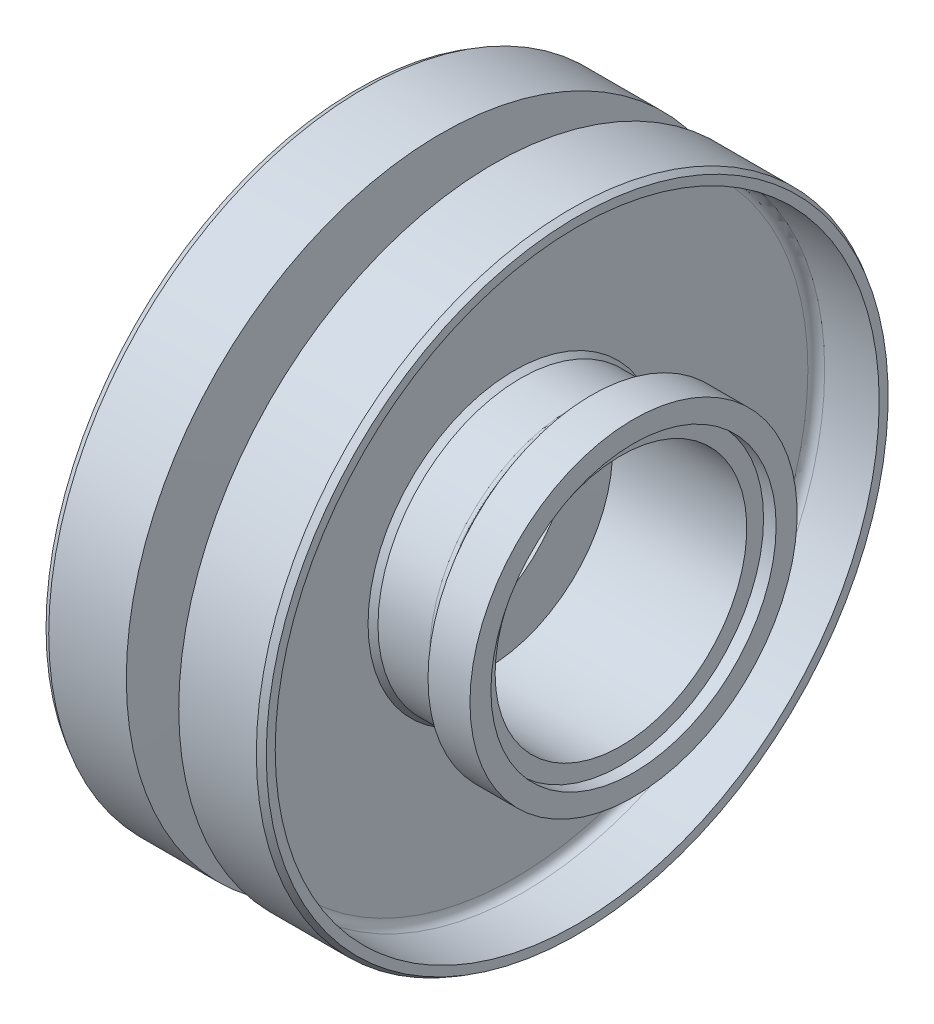
ISO-10303-21;
HEADER;
FILE_DESCRIPTION(('STEP AP214'),'2;1');
FILE_NAME('part.step','',(''),(''),'','','');
FILE_SCHEMA(('AUTOMOTIVE_DESIGN { 1 0 10303 214 1 1 1 1 }'));
ENDSEC;
DATA;
#1=APPLICATION_CONTEXT('core data for automotive mechanical design processes');
#2=APPLICATION_PROTOCOL_DEFINITION('international standard','automotive_design',2000,#1);
#3=PRODUCT_CONTEXT('',#1,'mechanical');
#4=PRODUCT('Part','Part','',(#3));
#5=PRODUCT_RELATED_PRODUCT_CATEGORY('part','',(#4));
#6=PRODUCT_DEFINITION_FORMATION('','',#4);
#7=PRODUCT_DEFINITION_CONTEXT('part definition',#1,'design');
#8=PRODUCT_DEFINITION('design','',#6,#7);
#9=PRODUCT_DEFINITION_SHAPE('','',#8);
#10=(LENGTH_UNIT() NAMED_UNIT(*) SI_UNIT(.MILLI.,.METRE.));
#11=(NAMED_UNIT(*) PLANE_ANGLE_UNIT() SI_UNIT($,.RADIAN.));
#12=(NAMED_UNIT(*) SI_UNIT($,.STERADIAN.) SOLID_ANGLE_UNIT());
#13=UNCERTAINTY_MEASURE_WITH_UNIT(LENGTH_MEASURE(1.E-05),#10,'distance_accuracy_value','');
#14=(GEOMETRIC_REPRESENTATION_CONTEXT(3) GLOBAL_UNCERTAINTY_ASSIGNED_CONTEXT((#13)) GLOBAL_UNIT_ASSIGNED_CONTEXT((#10,
#11,#12)) REPRESENTATION_CONTEXT('',''));
#15=CARTESIAN_POINT('',(0.,0.,0.));
#16=DIRECTION('',(0.,0.,1.));
#17=DIRECTION('',(1.,0.,0.));
#18=AXIS2_PLACEMENT_3D('',#15,#16,#17);
#19=CARTESIAN_POINT('',(-25.0552786765821,0.,0.));
#20=DIRECTION('',(-1.,0.,0.));
#21=DIRECTION('',(0.,0.,1.));
#22=AXIS2_PLACEMENT_3D('',#19,#20,#21);
#23=TOROIDAL_SURFACE('',#22,36.,2.);
#24=CARTESIAN_POINT('',(-26.6785653728717,0.,0.));
#25=DIRECTION('',(-1.,0.,0.));
#26=DIRECTION('',(0.,0.,1.));
#27=AXIS2_PLACEMENT_3D('',#24,#25,#26);
#28=CIRCLE('',#27,34.8316934042602);
#29=CARTESIAN_POINT('',(-26.6785653728717,0.,34.8316934042602));
#30=VERTEX_POINT('',#29);
#31=EDGE_CURVE('E97',#30,#30,#28,.T.);
#32=ORIENTED_EDGE('',*,*,#31,.F.);
#33=EDGE_LOOP('',(#32));
#34=FACE_BOUND('',#33,.T.);
#35=CARTESIAN_POINT('',(-25.0552786765821,0.,0.));
#36=DIRECTION('',(-1.,0.,0.));
#37=DIRECTION('',(0.,0.,1.));
#38=AXIS2_PLACEMENT_3D('',#35,#36,#37);
#39=CIRCLE('',#38,34.);
#40=CARTESIAN_POINT('',(-25.0552786765821,0.,34.));
#41=VERTEX_POINT('',#40);
#42=EDGE_CURVE('E11',#41,#41,#39,.T.);
#43=ORIENTED_EDGE('',*,*,#42,.T.);
#44=EDGE_LOOP('',(#43));
#45=FACE_BOUND('',#44,.T.);
#46=ADVANCED_FACE('F45',(#34,#45),#23,.F.);
#47=CARTESIAN_POINT('',(0.,0.,0.));
#48=DIRECTION('',(-1.,0.,0.));
#49=DIRECTION('',(0.,0.,1.));
#50=AXIS2_PLACEMENT_3D('',#47,#48,#49);
#51=CYLINDRICAL_SURFACE('',#50,34.);
#52=ORIENTED_EDGE('',*,*,#42,.F.);
#53=EDGE_LOOP('',(#52));
#54=FACE_BOUND('',#53,.T.);
#55=CARTESIAN_POINT('',(-12.75,0.,0.));
#56=DIRECTION('',(-1.,0.,0.));
#57=DIRECTION('',(0.,0.,1.));
#58=AXIS2_PLACEMENT_3D('',#55,#56,#57);
#59=CIRCLE('',#58,34.);
#60=CARTESIAN_POINT('',(-12.75,0.,34.));
#61=VERTEX_POINT('',#60);
#62=EDGE_CURVE('E51',#61,#61,#59,.T.);
#63=ORIENTED_EDGE('',*,*,#62,.T.);
#64=EDGE_LOOP('',(#63));
#65=FACE_BOUND('',#64,.T.);
#66=ADVANCED_FACE('F104',(#54,#65),#51,.T.);
#67=CARTESIAN_POINT('',(-11.25,0.,0.));
#68=DIRECTION('',(1.,0.,0.));
#69=DIRECTION('',(0.,0.,-1.));
#70=AXIS2_PLACEMENT_3D('',#67,#68,#69);
#71=CONICAL_SURFACE('',#70,34.8660254037845,0.523598775598304);
#72=ORIENTED_EDGE('',*,*,#62,.F.);
#73=EDGE_LOOP('',(#72));
#74=FACE_BOUND('',#73,.T.);
#75=CARTESIAN_POINT('',(-11.25,0.,0.));
#76=DIRECTION('',(-1.,0.,0.));
#77=DIRECTION('',(0.,0.,1.));
#78=AXIS2_PLACEMENT_3D('',#75,#76,#77);
#79=CIRCLE('',#78,34.8660254037845);
#80=CARTESIAN_POINT('',(-11.25,0.,34.8660254037845));
#81=VERTEX_POINT('',#80);
#82=EDGE_CURVE('E55',#81,#81,#79,.T.);
#83=ORIENTED_EDGE('',*,*,#82,.T.);
#84=EDGE_LOOP('',(#83));
#85=FACE_BOUND('',#84,.T.);
#86=ADVANCED_FACE('F108',(#74,#85),#71,.T.);
#87=CARTESIAN_POINT('',(-11.25,70.,0.));
#88=DIRECTION('',(1.,0.,0.));
#89=DIRECTION('',(0.,0.,-1.));
#90=AXIS2_PLACEMENT_3D('',#87,#88,#89);
#91=PLANE('',#90);
#92=ORIENTED_EDGE('',*,*,#82,.F.);
#93=EDGE_LOOP('',(#92));
#94=FACE_BOUND('',#93,.T.);
#95=CARTESIAN_POINT('',(-11.25,0.,0.));
#96=DIRECTION('',(-1.,0.,0.));
#97=DIRECTION('',(0.,0.,1.));
#98=AXIS2_PLACEMENT_3D('',#95,#96,#97);
#99=CIRCLE('',#98,70.);
#100=CARTESIAN_POINT('',(-11.25,0.,70.));
#101=VERTEX_POINT('',#100);
#102=EDGE_CURVE('E59',#101,#101,#99,.T.);
#103=ORIENTED_EDGE('',*,*,#102,.T.);
#104=EDGE_LOOP('',(#103));
#105=FACE_BOUND('',#104,.T.);
#106=ADVANCED_FACE('F113',(#94,#105),#91,.F.);
#107=CARTESIAN_POINT('',(-13.25,0.,0.));
#108=DIRECTION('',(-1.,0.,0.));
#109=DIRECTION('',(0.,0.,1.));
#110=AXIS2_PLACEMENT_3D('',#107,#108,#109);
#111=TOROIDAL_SURFACE('',#110,70.,1.99999999999999);
#112=ORIENTED_EDGE('',*,*,#102,.F.);
#113=EDGE_LOOP('',(#112));
#114=FACE_BOUND('',#113,.T.);
#115=CARTESIAN_POINT('',(-13.25,0.,0.));
#116=DIRECTION('',(-1.,0.,0.));
#117=DIRECTION('',(0.,0.,1.));
#118=AXIS2_PLACEMENT_3D('',#115,#116,#117);
#119=CIRCLE('',#118,72.);
#120=CARTESIAN_POINT('',(-13.25,0.,72.));
#121=VERTEX_POINT('',#120);
#122=EDGE_CURVE('E64',#121,#121,#119,.T.);
#123=ORIENTED_EDGE('',*,*,#122,.T.);
#124=EDGE_LOOP('',(#123));
#125=FACE_BOUND('',#124,.T.);
#126=ADVANCED_FACE('F119',(#114,#125),#111,.F.);
#127=CARTESIAN_POINT('',(0.,0.,0.));
#128=DIRECTION('',(-1.,0.,0.));
#129=DIRECTION('',(0.,0.,1.));
#130=AXIS2_PLACEMENT_3D('',#127,#128,#129);
#131=CYLINDRICAL_SURFACE('',#130,72.);
#132=ORIENTED_EDGE('',*,*,#122,.F.);
#133=EDGE_LOOP('',(#132));
#134=FACE_BOUND('',#133,.T.);
#135=CARTESIAN_POINT('',(-26.25,0.,0.));
#136=DIRECTION('',(-1.,0.,0.));
#137=DIRECTION('',(0.,0.,1.));
#138=AXIS2_PLACEMENT_3D('',#135,#136,#137);
#139=CIRCLE('',#138,72.);
#140=CARTESIAN_POINT('',(-26.25,0.,72.));
#141=VERTEX_POINT('',#140);
#142=EDGE_CURVE('E67',#141,#141,#139,.T.);
#143=ORIENTED_EDGE('',*,*,#142,.T.);
#144=EDGE_LOOP('',(#143));
#145=FACE_BOUND('',#144,.T.);
#146=ADVANCED_FACE('F123',(#134,#145),#131,.F.);
#147=CARTESIAN_POINT('',(-26.25,74.1339745962156,0.));
#148=DIRECTION('',(1.,0.,0.));
#149=DIRECTION('',(0.,0.,-1.));
#150=AXIS2_PLACEMENT_3D('',#147,#148,#149);
#151=PLANE('',#150);
#152=ORIENTED_EDGE('',*,*,#142,.F.);
#153=EDGE_LOOP('',(#152));
#154=FACE_BOUND('',#153,.T.);
#155=CARTESIAN_POINT('',(-26.25,0.,0.));
#156=DIRECTION('',(-1.,0.,0.));
#157=DIRECTION('',(0.,0.,1.));
#158=AXIS2_PLACEMENT_3D('',#155,#156,#157);
#159=CIRCLE('',#158,74.1339745962156);
#160=CARTESIAN_POINT('',(-26.25,0.,74.1339745962156));
#161=VERTEX_POINT('',#160);
#162=EDGE_CURVE('E70',#161,#161,#159,.T.);
#163=ORIENTED_EDGE('',*,*,#162,.T.);
#164=EDGE_LOOP('',(#163));
#165=FACE_BOUND('',#164,.T.);
#166=ADVANCED_FACE('F127',(#154,#165),#151,.F.);
#167=CARTESIAN_POINT('',(-24.75,0.,0.));
#168=DIRECTION('',(1.,0.,0.));
#169=DIRECTION('',(0.,0.,-1.));
#170=AXIS2_PLACEMENT_3D('',#167,#168,#169);
#171=CONICAL_SURFACE('',#170,75.,0.523598775598296);
#172=ORIENTED_EDGE('',*,*,#162,.F.);
#173=EDGE_LOOP('',(#172));
#174=FACE_BOUND('',#173,.T.);
#175=CARTESIAN_POINT('',(-24.75,0.,0.));
#176=DIRECTION('',(-1.,0.,0.));
#177=DIRECTION('',(0.,0.,1.));
#178=AXIS2_PLACEMENT_3D('',#175,#176,#177);
#179=CIRCLE('',#178,75.);
#180=CARTESIAN_POINT('',(-24.75,0.,75.));
#181=VERTEX_POINT('',#180);
#182=EDGE_CURVE('E73',#181,#181,#179,.T.);
#183=ORIENTED_EDGE('',*,*,#182,.T.);
#184=EDGE_LOOP('',(#183));
#185=FACE_BOUND('',#184,.T.);
#186=ADVANCED_FACE('F131',(#174,#185),#171,.T.);
#187=CARTESIAN_POINT('',(0.,0.,0.));
#188=DIRECTION('',(-1.,0.,0.));
#189=DIRECTION('',(0.,0.,1.));
#190=AXIS2_PLACEMENT_3D('',#187,#188,#189);
#191=CYLINDRICAL_SURFACE('',#190,75.);
#192=ORIENTED_EDGE('',*,*,#182,.F.);
#193=EDGE_LOOP('',(#192));
#194=FACE_BOUND('',#193,.T.);
#195=CARTESIAN_POINT('',(-6.25,0.,0.));
#196=DIRECTION('',(-1.,0.,0.));
#197=DIRECTION('',(0.,0.,1.));
#198=AXIS2_PLACEMENT_3D('',#195,#196,#197);
#199=CIRCLE('',#198,75.);
#200=CARTESIAN_POINT('',(-6.25,0.,75.));
#201=VERTEX_POINT('',#200);
#202=EDGE_CURVE('E76',#201,#201,#199,.T.);
#203=ORIENTED_EDGE('',*,*,#202,.T.);
#204=EDGE_LOOP('',(#203));
#205=FACE_BOUND('',#204,.T.);
#206=ADVANCED_FACE('F135',(#194,#205),#191,.T.);
#207=CARTESIAN_POINT('',(-4.67856537287168,0.,0.));
#208=DIRECTION('',(-1.,0.,0.));
#209=DIRECTION('',(0.,0.,1.));
#210=AXIS2_PLACEMENT_3D('',#207,#208,#209);
#211=CONICAL_SURFACE('',#210,30.,1.53588974175502);
#212=ORIENTED_EDGE('',*,*,#202,.F.);
#213=EDGE_LOOP('',(#212));
#214=FACE_BOUND('',#213,.T.);
#215=CARTESIAN_POINT('',(-4.67856537287168,0.,0.));
#216=DIRECTION('',(-1.,0.,0.));
#217=DIRECTION('',(0.,0.,1.));
#218=AXIS2_PLACEMENT_3D('',#215,#216,#217);
#219=CIRCLE('',#218,30.);
#220=CARTESIAN_POINT('',(-4.67856537287168,0.,30.));
#221=VERTEX_POINT('',#220);
#222=EDGE_CURVE('E79',#221,#221,#219,.T.);
#223=ORIENTED_EDGE('',*,*,#222,.T.);
#224=EDGE_LOOP('',(#223));
#225=FACE_BOUND('',#224,.T.);
#226=ADVANCED_FACE('F139',(#214,#225),#211,.T.);
#227=CARTESIAN_POINT('',(0.,0.,0.));
#228=DIRECTION('',(-1.,0.,0.));
#229=DIRECTION('',(0.,0.,1.));
#230=AXIS2_PLACEMENT_3D('',#227,#228,#229);
#231=CYLINDRICAL_SURFACE('',#230,30.);
#232=ORIENTED_EDGE('',*,*,#222,.F.);
#233=EDGE_LOOP('',(#232));
#234=FACE_BOUND('',#233,.T.);
#235=CARTESIAN_POINT('',(-36.6785653728717,0.,0.));
#236=DIRECTION('',(-1.,0.,0.));
#237=DIRECTION('',(0.,0.,1.));
#238=AXIS2_PLACEMENT_3D('',#235,#236,#237);
#239=CIRCLE('',#238,30.);
#240=CARTESIAN_POINT('',(-36.6785653728717,0.,30.));
#241=VERTEX_POINT('',#240);
#242=EDGE_CURVE('E82',#241,#241,#239,.T.);
#243=ORIENTED_EDGE('',*,*,#242,.T.);
#244=EDGE_LOOP('',(#243));
#245=FACE_BOUND('',#244,.T.);
#246=ADVANCED_FACE('F143',(#234,#245),#231,.F.);
#247=CARTESIAN_POINT('',(-36.6785653728717,34.,0.));
#248=DIRECTION('',(1.,0.,0.));
#249=DIRECTION('',(0.,0.,-1.));
#250=AXIS2_PLACEMENT_3D('',#247,#248,#249);
#251=PLANE('',#250);
#252=ORIENTED_EDGE('',*,*,#242,.F.);
#253=EDGE_LOOP('',(#252));
#254=FACE_BOUND('',#253,.T.);
#255=CARTESIAN_POINT('',(-36.6785653728717,0.,0.));
#256=DIRECTION('',(-1.,0.,0.));
#257=DIRECTION('',(0.,0.,1.));
#258=AXIS2_PLACEMENT_3D('',#255,#256,#257);
#259=CIRCLE('',#258,34.);
#260=CARTESIAN_POINT('',(-36.6785653728717,0.,34.));
#261=VERTEX_POINT('',#260);
#262=EDGE_CURVE('E85',#261,#261,#259,.T.);
#263=ORIENTED_EDGE('',*,*,#262,.T.);
#264=EDGE_LOOP('',(#263));
#265=FACE_BOUND('',#264,.T.);
#266=ADVANCED_FACE('F147',(#254,#265),#251,.F.);
#267=CARTESIAN_POINT('',(0.,0.,0.));
#268=DIRECTION('',(-1.,0.,0.));
#269=DIRECTION('',(0.,0.,1.));
#270=AXIS2_PLACEMENT_3D('',#267,#268,#269);
#271=CYLINDRICAL_SURFACE('',#270,34.);
#272=ORIENTED_EDGE('',*,*,#262,.F.);
#273=EDGE_LOOP('',(#272));
#274=FACE_BOUND('',#273,.T.);
#275=CARTESIAN_POINT('',(-39.6785653728717,0.,0.));
#276=DIRECTION('',(-1.,0.,0.));
#277=DIRECTION('',(0.,0.,1.));
#278=AXIS2_PLACEMENT_3D('',#275,#276,#277);
#279=CIRCLE('',#278,34.);
#280=CARTESIAN_POINT('',(-39.6785653728717,0.,34.));
#281=VERTEX_POINT('',#280);
#282=EDGE_CURVE('E88',#281,#281,#279,.T.);
#283=ORIENTED_EDGE('',*,*,#282,.T.);
#284=EDGE_LOOP('',(#283));
#285=FACE_BOUND('',#284,.T.);
#286=ADVANCED_FACE('F151',(#274,#285),#271,.F.);
#287=CARTESIAN_POINT('',(-39.6785653728717,39.,0.));
#288=DIRECTION('',(1.,0.,0.));
#289=DIRECTION('',(0.,0.,-1.));
#290=AXIS2_PLACEMENT_3D('',#287,#288,#289);
#291=PLANE('',#290);
#292=ORIENTED_EDGE('',*,*,#282,.F.);
#293=EDGE_LOOP('',(#292));
#294=FACE_BOUND('',#293,.T.);
#295=CARTESIAN_POINT('',(-39.6785653728717,0.,0.));
#296=DIRECTION('',(-1.,0.,0.));
#297=DIRECTION('',(0.,0.,1.));
#298=AXIS2_PLACEMENT_3D('',#295,#296,#297);
#299=CIRCLE('',#298,39.);
#300=CARTESIAN_POINT('',(-39.6785653728717,0.,39.));
#301=VERTEX_POINT('',#300);
#302=EDGE_CURVE('E91',#301,#301,#299,.T.);
#303=ORIENTED_EDGE('',*,*,#302,.T.);
#304=EDGE_LOOP('',(#303));
#305=FACE_BOUND('',#304,.T.);
#306=ADVANCED_FACE('F155',(#294,#305),#291,.F.);
#307=CARTESIAN_POINT('',(0.,0.,0.));
#308=DIRECTION('',(-1.,0.,0.));
#309=DIRECTION('',(0.,0.,1.));
#310=AXIS2_PLACEMENT_3D('',#307,#308,#309);
#311=CYLINDRICAL_SURFACE('',#310,39.);
#312=ORIENTED_EDGE('',*,*,#302,.F.);
#313=EDGE_LOOP('',(#312));
#314=FACE_BOUND('',#313,.T.);
#315=CARTESIAN_POINT('',(-29.6785653728717,0.,0.));
#316=DIRECTION('',(-1.,0.,0.));
#317=DIRECTION('',(0.,0.,1.));
#318=AXIS2_PLACEMENT_3D('',#315,#316,#317);
#319=CIRCLE('',#318,39.);
#320=CARTESIAN_POINT('',(-29.6785653728717,0.,39.));
#321=VERTEX_POINT('',#320);
#322=EDGE_CURVE('E94',#321,#321,#319,.T.);
#323=ORIENTED_EDGE('',*,*,#322,.T.);
#324=EDGE_LOOP('',(#323));
#325=FACE_BOUND('',#324,.T.);
#326=ADVANCED_FACE('F159',(#314,#325),#311,.T.);
#327=CARTESIAN_POINT('',(-26.6785653728717,0.,0.));
#328=DIRECTION('',(-1.,0.,0.));
#329=DIRECTION('',(0.,0.,1.));
#330=AXIS2_PLACEMENT_3D('',#327,#328,#329);
#331=CONICAL_SURFACE('',#330,34.8316934042602,0.946959855947359);
#332=ORIENTED_EDGE('',*,*,#322,.F.);
#333=EDGE_LOOP('',(#332));
#334=FACE_BOUND('',#333,.T.);
#335=ORIENTED_EDGE('',*,*,#31,.T.);
#336=EDGE_LOOP('',(#335));
#337=FACE_BOUND('',#336,.T.);
#338=ADVANCED_FACE('F101',(#334,#337),#331,.T.);
#339=CLOSED_SHELL('',(#46,#66,#86,#106,#126,#146,#166,#186,#206,#226,#246,#266,#286,#306,#326,#338));
#340=MANIFOLD_SOLID_BREP('B2',#339);
#341=CARTESIAN_POINT('',(6.25,0.,0.));
#342=DIRECTION('',(1.,0.,0.));
#343=DIRECTION('',(0.,0.,-1.));
#344=AXIS2_PLACEMENT_3D('',#341,#342,#343);
#345=CONICAL_SURFACE('',#344,75.,1.53588974175502);
#346=CARTESIAN_POINT('',(4.67856537287168,0.,0.));
#347=DIRECTION('',(-1.,0.,0.));
#348=DIRECTION('',(0.,0.,1.));
#349=AXIS2_PLACEMENT_3D('',#346,#347,#348);
#350=CIRCLE('',#349,30.);
#351=CARTESIAN_POINT('',(4.67856537287168,0.,30.));
#352=VERTEX_POINT('',#351);
#353=EDGE_CURVE('E44',#352,#352,#350,.T.);
#354=ORIENTED_EDGE('',*,*,#353,.F.);
#355=EDGE_LOOP('',(#354));
#356=FACE_BOUND('',#355,.T.);
#357=CARTESIAN_POINT('',(6.25,0.,0.));
#358=DIRECTION('',(-1.,0.,0.));
#359=DIRECTION('',(0.,0.,1.));
#360=AXIS2_PLACEMENT_3D('',#357,#358,#359);
#361=CIRCLE('',#360,75.);
#362=CARTESIAN_POINT('',(6.25,0.,75.));
#363=VERTEX_POINT('',#362);
#364=EDGE_CURVE('E371',#363,#363,#361,.T.);
#365=ORIENTED_EDGE('',*,*,#364,.T.);
#366=EDGE_LOOP('',(#365));
#367=FACE_BOUND('',#366,.T.);
#368=ADVANCED_FACE('F319',(#356,#367),#345,.T.);
#369=CARTESIAN_POINT('',(0.,0.,0.));
#370=DIRECTION('',(-1.,0.,0.));
#371=DIRECTION('',(0.,0.,1.));
#372=AXIS2_PLACEMENT_3D('',#369,#370,#371);
#373=CYLINDRICAL_SURFACE('',#372,30.);
#374=CARTESIAN_POINT('',(36.6785653728717,0.,0.));
#375=DIRECTION('',(-1.,0.,0.));
#376=DIRECTION('',(0.,0.,1.));
#377=AXIS2_PLACEMENT_3D('',#374,#375,#376);
#378=CIRCLE('',#377,30.);
#379=CARTESIAN_POINT('',(36.6785653728717,0.,30.));
#380=VERTEX_POINT('',#379);
#381=EDGE_CURVE('E325',#380,#380,#378,.T.);
#382=ORIENTED_EDGE('',*,*,#381,.F.);
#383=EDGE_LOOP('',(#382));
#384=FACE_BOUND('',#383,.T.);
#385=ORIENTED_EDGE('',*,*,#353,.T.);
#386=EDGE_LOOP('',(#385));
#387=FACE_BOUND('',#386,.T.);
#388=ADVANCED_FACE('F456',(#384,#387),#373,.F.);
#389=CARTESIAN_POINT('',(36.6785653728717,34.,0.));
#390=DIRECTION('',(-1.,0.,0.));
#391=DIRECTION('',(0.,0.,1.));
#392=AXIS2_PLACEMENT_3D('',#389,#390,#391);
#393=PLANE('',#392);
#394=CARTESIAN_POINT('',(36.6785653728717,0.,0.));
#395=DIRECTION('',(-1.,0.,0.));
#396=DIRECTION('',(0.,0.,1.));
#397=AXIS2_PLACEMENT_3D('',#394,#395,#396);
#398=CIRCLE('',#397,34.);
#399=CARTESIAN_POINT('',(36.6785653728717,0.,34.));
#400=VERTEX_POINT('',#399);
#401=EDGE_CURVE('E329',#400,#400,#398,.T.);
#402=ORIENTED_EDGE('',*,*,#401,.F.);
#403=EDGE_LOOP('',(#402));
#404=FACE_BOUND('',#403,.T.);
#405=ORIENTED_EDGE('',*,*,#381,.T.);
#406=EDGE_LOOP('',(#405));
#407=FACE_BOUND('',#406,.T.);
#408=ADVANCED_FACE('F451',(#404,#407),#393,.F.);
#409=CARTESIAN_POINT('',(0.,0.,0.));
#410=DIRECTION('',(-1.,0.,0.));
#411=DIRECTION('',(0.,0.,1.));
#412=AXIS2_PLACEMENT_3D('',#409,#410,#411);
#413=CYLINDRICAL_SURFACE('',#412,34.);
#414=CARTESIAN_POINT('',(39.6785653728717,0.,0.));
#415=DIRECTION('',(-1.,0.,0.));
#416=DIRECTION('',(0.,0.,1.));
#417=AXIS2_PLACEMENT_3D('',#414,#415,#416);
#418=CIRCLE('',#417,34.);
#419=CARTESIAN_POINT('',(39.6785653728717,0.,34.));
#420=VERTEX_POINT('',#419);
#421=EDGE_CURVE('E333',#420,#420,#418,.T.);
#422=ORIENTED_EDGE('',*,*,#421,.F.);
#423=EDGE_LOOP('',(#422));
#424=FACE_BOUND('',#423,.T.);
#425=ORIENTED_EDGE('',*,*,#401,.T.);
#426=EDGE_LOOP('',(#425));
#427=FACE_BOUND('',#426,.T.);
#428=ADVANCED_FACE('F445',(#424,#427),#413,.F.);
#429=CARTESIAN_POINT('',(39.6785653728717,39.,0.));
#430=DIRECTION('',(-1.,0.,0.));
#431=DIRECTION('',(0.,0.,1.));
#432=AXIS2_PLACEMENT_3D('',#429,#430,#431);
#433=PLANE('',#432);
#434=CARTESIAN_POINT('',(39.6785653728717,0.,0.));
#435=DIRECTION('',(-1.,0.,0.));
#436=DIRECTION('',(0.,0.,1.));
#437=AXIS2_PLACEMENT_3D('',#434,#435,#436);
#438=CIRCLE('',#437,39.);
#439=CARTESIAN_POINT('',(39.6785653728717,0.,39.));
#440=VERTEX_POINT('',#439);
#441=EDGE_CURVE('E338',#440,#440,#438,.T.);
#442=ORIENTED_EDGE('',*,*,#441,.F.);
#443=EDGE_LOOP('',(#442));
#444=FACE_BOUND('',#443,.T.);
#445=ORIENTED_EDGE('',*,*,#421,.T.);
#446=EDGE_LOOP('',(#445));
#447=FACE_BOUND('',#446,.T.);
#448=ADVANCED_FACE('F439',(#444,#447),#433,.F.);
#449=CARTESIAN_POINT('',(0.,0.,0.));
#450=DIRECTION('',(-1.,0.,0.));
#451=DIRECTION('',(0.,0.,1.));
#452=AXIS2_PLACEMENT_3D('',#449,#450,#451);
#453=CYLINDRICAL_SURFACE('',#452,39.);
#454=CARTESIAN_POINT('',(29.6785653728717,0.,0.));
#455=DIRECTION('',(-1.,0.,0.));
#456=DIRECTION('',(0.,0.,1.));
#457=AXIS2_PLACEMENT_3D('',#454,#455,#456);
#458=CIRCLE('',#457,39.);
#459=CARTESIAN_POINT('',(29.6785653728717,0.,39.));
#460=VERTEX_POINT('',#459);
#461=EDGE_CURVE('E341',#460,#460,#458,.T.);
#462=ORIENTED_EDGE('',*,*,#461,.F.);
#463=EDGE_LOOP('',(#462));
#464=FACE_BOUND('',#463,.T.);
#465=ORIENTED_EDGE('',*,*,#441,.T.);
#466=EDGE_LOOP('',(#465));
#467=FACE_BOUND('',#466,.T.);
#468=ADVANCED_FACE('F433',(#464,#467),#453,.T.);
#469=CARTESIAN_POINT('',(29.6785653728717,0.,0.));
#470=DIRECTION('',(1.,0.,0.));
#471=DIRECTION('',(0.,0.,-1.));
#472=AXIS2_PLACEMENT_3D('',#469,#470,#471);
#473=CONICAL_SURFACE('',#472,39.,0.946959855947359);
#474=CARTESIAN_POINT('',(26.6785653728717,0.,0.));
#475=DIRECTION('',(-1.,0.,0.));
#476=DIRECTION('',(0.,0.,1.));
#477=AXIS2_PLACEMENT_3D('',#474,#475,#476);
#478=CIRCLE('',#477,34.8316934042602);
#479=CARTESIAN_POINT('',(26.6785653728717,0.,34.8316934042602));
#480=VERTEX_POINT('',#479);
#481=EDGE_CURVE('E344',#480,#480,#478,.T.);
#482=ORIENTED_EDGE('',*,*,#481,.F.);
#483=EDGE_LOOP('',(#482));
#484=FACE_BOUND('',#483,.T.);
#485=ORIENTED_EDGE('',*,*,#461,.T.);
#486=EDGE_LOOP('',(#485));
#487=FACE_BOUND('',#486,.T.);
#488=ADVANCED_FACE('F427',(#484,#487),#473,.T.);
#489=CARTESIAN_POINT('',(25.0552786765821,0.,0.));
#490=DIRECTION('',(-1.,0.,0.));
#491=DIRECTION('',(0.,0.,1.));
#492=AXIS2_PLACEMENT_3D('',#489,#490,#491);
#493=TOROIDAL_SURFACE('',#492,36.,2.);
#494=CARTESIAN_POINT('',(25.0552786765821,0.,0.));
#495=DIRECTION('',(-1.,0.,0.));
#496=DIRECTION('',(0.,0.,1.));
#497=AXIS2_PLACEMENT_3D('',#494,#495,#496);
#498=CIRCLE('',#497,34.);
#499=CARTESIAN_POINT('',(25.0552786765821,0.,34.));
#500=VERTEX_POINT('',#499);
#501=EDGE_CURVE('E347',#500,#500,#498,.T.);
#502=ORIENTED_EDGE('',*,*,#501,.F.);
#503=EDGE_LOOP('',(#502));
#504=FACE_BOUND('',#503,.T.);
#505=ORIENTED_EDGE('',*,*,#481,.T.);
#506=EDGE_LOOP('',(#505));
#507=FACE_BOUND('',#506,.T.);
#508=ADVANCED_FACE('F421',(#504,#507),#493,.F.);
#509=CARTESIAN_POINT('',(0.,0.,0.));
#510=DIRECTION('',(-1.,0.,0.));
#511=DIRECTION('',(0.,0.,1.));
#512=AXIS2_PLACEMENT_3D('',#509,#510,#511);
#513=CYLINDRICAL_SURFACE('',#512,34.);
#514=CARTESIAN_POINT('',(12.75,0.,0.));
#515=DIRECTION('',(-1.,0.,0.));
#516=DIRECTION('',(0.,0.,1.));
#517=AXIS2_PLACEMENT_3D('',#514,#515,#516);
#518=CIRCLE('',#517,34.);
#519=CARTESIAN_POINT('',(12.75,0.,34.));
#520=VERTEX_POINT('',#519);
#521=EDGE_CURVE('E350',#520,#520,#518,.T.);
#522=ORIENTED_EDGE('',*,*,#521,.F.);
#523=EDGE_LOOP('',(#522));
#524=FACE_BOUND('',#523,.T.);
#525=ORIENTED_EDGE('',*,*,#501,.T.);
#526=EDGE_LOOP('',(#525));
#527=FACE_BOUND('',#526,.T.);
#528=ADVANCED_FACE('F415',(#524,#527),#513,.T.);
#529=CARTESIAN_POINT('',(12.75,0.,0.));
#530=DIRECTION('',(-1.,0.,0.));
#531=DIRECTION('',(0.,0.,1.));
#532=AXIS2_PLACEMENT_3D('',#529,#530,#531);
#533=CONICAL_SURFACE('',#532,34.,0.523598775598304);
#534=CARTESIAN_POINT('',(11.25,0.,0.));
#535=DIRECTION('',(-1.,0.,0.));
#536=DIRECTION('',(0.,0.,1.));
#537=AXIS2_PLACEMENT_3D('',#534,#535,#536);
#538=CIRCLE('',#537,34.8660254037845);
#539=CARTESIAN_POINT('',(11.25,0.,34.8660254037845));
#540=VERTEX_POINT('',#539);
#541=EDGE_CURVE('E353',#540,#540,#538,.T.);
#542=ORIENTED_EDGE('',*,*,#541,.F.);
#543=EDGE_LOOP('',(#542));
#544=FACE_BOUND('',#543,.T.);
#545=ORIENTED_EDGE('',*,*,#521,.T.);
#546=EDGE_LOOP('',(#545));
#547=FACE_BOUND('',#546,.T.);
#548=ADVANCED_FACE('F409',(#544,#547),#533,.T.);
#549=CARTESIAN_POINT('',(11.25,70.,0.));
#550=DIRECTION('',(-1.,0.,0.));
#551=DIRECTION('',(0.,0.,1.));
#552=AXIS2_PLACEMENT_3D('',#549,#550,#551);
#553=PLANE('',#552);
#554=CARTESIAN_POINT('',(11.25,0.,0.));
#555=DIRECTION('',(-1.,0.,0.));
#556=DIRECTION('',(0.,0.,1.));
#557=AXIS2_PLACEMENT_3D('',#554,#555,#556);
#558=CIRCLE('',#557,70.);
#559=CARTESIAN_POINT('',(11.25,0.,70.));
#560=VERTEX_POINT('',#559);
#561=EDGE_CURVE('E356',#560,#560,#558,.T.);
#562=ORIENTED_EDGE('',*,*,#561,.F.);
#563=EDGE_LOOP('',(#562));
#564=FACE_BOUND('',#563,.T.);
#565=ORIENTED_EDGE('',*,*,#541,.T.);
#566=EDGE_LOOP('',(#565));
#567=FACE_BOUND('',#566,.T.);
#568=ADVANCED_FACE('F403',(#564,#567),#553,.F.);
#569=CARTESIAN_POINT('',(13.25,0.,0.));
#570=DIRECTION('',(-1.,0.,0.));
#571=DIRECTION('',(0.,0.,1.));
#572=AXIS2_PLACEMENT_3D('',#569,#570,#571);
#573=TOROIDAL_SURFACE('',#572,70.,1.99999999999999);
#574=CARTESIAN_POINT('',(13.25,0.,0.));
#575=DIRECTION('',(-1.,0.,0.));
#576=DIRECTION('',(0.,0.,1.));
#577=AXIS2_PLACEMENT_3D('',#574,#575,#576);
#578=CIRCLE('',#577,72.);
#579=CARTESIAN_POINT('',(13.25,0.,72.));
#580=VERTEX_POINT('',#579);
#581=EDGE_CURVE('E359',#580,#580,#578,.T.);
#582=ORIENTED_EDGE('',*,*,#581,.F.);
#583=EDGE_LOOP('',(#582));
#584=FACE_BOUND('',#583,.T.);
#585=ORIENTED_EDGE('',*,*,#561,.T.);
#586=EDGE_LOOP('',(#585));
#587=FACE_BOUND('',#586,.T.);
#588=ADVANCED_FACE('F397',(#584,#587),#573,.F.);
#589=CARTESIAN_POINT('',(0.,0.,0.));
#590=DIRECTION('',(-1.,0.,0.));
#591=DIRECTION('',(0.,0.,1.));
#592=AXIS2_PLACEMENT_3D('',#589,#590,#591);
#593=CYLINDRICAL_SURFACE('',#592,72.);
#594=CARTESIAN_POINT('',(26.25,0.,0.));
#595=DIRECTION('',(-1.,0.,0.));
#596=DIRECTION('',(0.,0.,1.));
#597=AXIS2_PLACEMENT_3D('',#594,#595,#596);
#598=CIRCLE('',#597,72.);
#599=CARTESIAN_POINT('',(26.25,0.,72.));
#600=VERTEX_POINT('',#599);
#601=EDGE_CURVE('E362',#600,#600,#598,.T.);
#602=ORIENTED_EDGE('',*,*,#601,.F.);
#603=EDGE_LOOP('',(#602));
#604=FACE_BOUND('',#603,.T.);
#605=ORIENTED_EDGE('',*,*,#581,.T.);
#606=EDGE_LOOP('',(#605));
#607=FACE_BOUND('',#606,.T.);
#608=ADVANCED_FACE('F391',(#604,#607),#593,.F.);
#609=CARTESIAN_POINT('',(26.25,74.1339745962156,0.));
#610=DIRECTION('',(-1.,0.,0.));
#611=DIRECTION('',(0.,0.,1.));
#612=AXIS2_PLACEMENT_3D('',#609,#610,#611);
#613=PLANE('',#612);
#614=CARTESIAN_POINT('',(26.25,0.,0.));
#615=DIRECTION('',(-1.,0.,0.));
#616=DIRECTION('',(0.,0.,1.));
#617=AXIS2_PLACEMENT_3D('',#614,#615,#616);
#618=CIRCLE('',#617,74.1339745962156);
#619=CARTESIAN_POINT('',(26.25,0.,74.1339745962156));
#620=VERTEX_POINT('',#619);
#621=EDGE_CURVE('E365',#620,#620,#618,.T.);
#622=ORIENTED_EDGE('',*,*,#621,.F.);
#623=EDGE_LOOP('',(#622));
#624=FACE_BOUND('',#623,.T.);
#625=ORIENTED_EDGE('',*,*,#601,.T.);
#626=EDGE_LOOP('',(#625));
#627=FACE_BOUND('',#626,.T.);
#628=ADVANCED_FACE('F385',(#624,#627),#613,.F.);
#629=CARTESIAN_POINT('',(26.25,0.,0.));
#630=DIRECTION('',(-1.,0.,0.));
#631=DIRECTION('',(0.,0.,1.));
#632=AXIS2_PLACEMENT_3D('',#629,#630,#631);
#633=CONICAL_SURFACE('',#632,74.1339745962156,0.523598775598296);
#634=CARTESIAN_POINT('',(24.75,0.,0.));
#635=DIRECTION('',(-1.,0.,0.));
#636=DIRECTION('',(0.,0.,1.));
#637=AXIS2_PLACEMENT_3D('',#634,#635,#636);
#638=CIRCLE('',#637,75.);
#639=CARTESIAN_POINT('',(24.75,0.,75.));
#640=VERTEX_POINT('',#639);
#641=EDGE_CURVE('E368',#640,#640,#638,.T.);
#642=ORIENTED_EDGE('',*,*,#641,.F.);
#643=EDGE_LOOP('',(#642));
#644=FACE_BOUND('',#643,.T.);
#645=ORIENTED_EDGE('',*,*,#621,.T.);
#646=EDGE_LOOP('',(#645));
#647=FACE_BOUND('',#646,.T.);
#648=ADVANCED_FACE('F379',(#644,#647),#633,.T.);
#649=CARTESIAN_POINT('',(0.,0.,0.));
#650=DIRECTION('',(-1.,0.,0.));
#651=DIRECTION('',(0.,0.,1.));
#652=AXIS2_PLACEMENT_3D('',#649,#650,#651);
#653=CYLINDRICAL_SURFACE('',#652,75.);
#654=ORIENTED_EDGE('',*,*,#364,.F.);
#655=EDGE_LOOP('',(#654));
#656=FACE_BOUND('',#655,.T.);
#657=ORIENTED_EDGE('',*,*,#641,.T.);
#658=EDGE_LOOP('',(#657));
#659=FACE_BOUND('',#658,.T.);
#660=ADVANCED_FACE('F376',(#656,#659),#653,.T.);
#661=CLOSED_SHELL('',(#368,#388,#408,#428,#448,#468,#488,#508,#528,#548,#568,#588,#608,#628,
#648,#660));
#662=MANIFOLD_SOLID_BREP('B6',#661);
#663=ADVANCED_BREP_SHAPE_REPRESENTATION('',(#18,#340,#662),#14);
#664=SHAPE_DEFINITION_REPRESENTATION(#9,#663);
ENDSEC;
END-ISO-10303-21;
